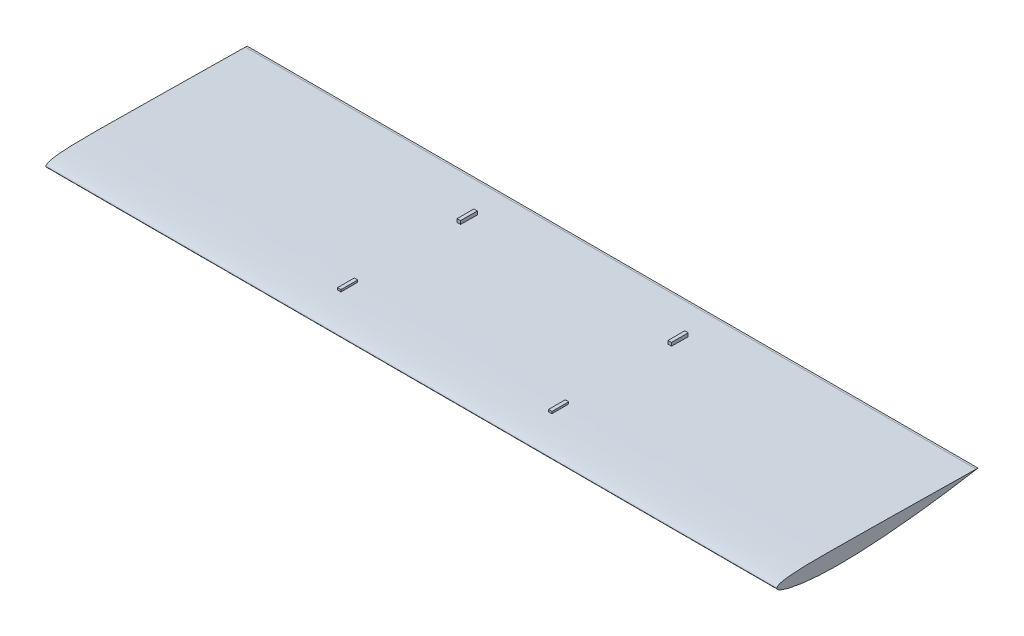
ISO-10303-21;
HEADER;
FILE_DESCRIPTION(('STEP AP214'),'2;1');
FILE_NAME('part.step','',(''),(''),'','','');
FILE_SCHEMA(('AUTOMOTIVE_DESIGN { 1 0 10303 214 1 1 1 1 }'));
ENDSEC;
DATA;
#1=APPLICATION_CONTEXT('core data for automotive mechanical design processes');
#2=APPLICATION_PROTOCOL_DEFINITION('international standard','automotive_design',2000,#1);
#3=PRODUCT_CONTEXT('',#1,'mechanical');
#4=PRODUCT('Part','Part','',(#3));
#5=PRODUCT_RELATED_PRODUCT_CATEGORY('part','',(#4));
#6=PRODUCT_DEFINITION_FORMATION('','',#4);
#7=PRODUCT_DEFINITION_CONTEXT('part definition',#1,'design');
#8=PRODUCT_DEFINITION('design','',#6,#7);
#9=PRODUCT_DEFINITION_SHAPE('','',#8);
#10=(LENGTH_UNIT() NAMED_UNIT(*) SI_UNIT(.MILLI.,.METRE.));
#11=(NAMED_UNIT(*) PLANE_ANGLE_UNIT() SI_UNIT($,.RADIAN.));
#12=(NAMED_UNIT(*) SI_UNIT($,.STERADIAN.) SOLID_ANGLE_UNIT());
#13=UNCERTAINTY_MEASURE_WITH_UNIT(LENGTH_MEASURE(1.E-05),#10,'distance_accuracy_value','');
#14=(GEOMETRIC_REPRESENTATION_CONTEXT(3) GLOBAL_UNCERTAINTY_ASSIGNED_CONTEXT((#13)) GLOBAL_UNIT_ASSIGNED_CONTEXT((#10,
#11,#12)) REPRESENTATION_CONTEXT('',''));
#15=CARTESIAN_POINT('',(0.,0.,0.));
#16=DIRECTION('',(0.,0.,1.));
#17=DIRECTION('',(1.,0.,0.));
#18=AXIS2_PLACEMENT_3D('',#15,#16,#17);
#19=CARTESIAN_POINT('',(-204.914499999998,2.03933345455898,1563.28431314968));
#20=DIRECTION('',(0.,0.,1.));
#21=DIRECTION('',(1.,0.,0.));
#22=AXIS2_PLACEMENT_3D('',#19,#20,#21);
#23=PLANE('',#22);
#24=DIRECTION('',(0.,1.,0.));
#25=VECTOR('',#24,1.);
#26=CARTESIAN_POINT('',(-204.914499999998,2.03933345455898,1563.28431314968));
#27=LINE('',#26,#25);
#28=CARTESIAN_POINT('',(-204.914499999998,80.0036239499038,1563.28431314969));
#29=VERTEX_POINT('',#28);
#30=CARTESIAN_POINT('',(-204.914499999998,83.8159031499461,1563.28431314968));
#31=VERTEX_POINT('',#30);
#32=EDGE_CURVE('E10',#29,#31,#27,.T.);
#33=ORIENTED_EDGE('',*,*,#32,.F.);
#34=DIRECTION('',(1.,0.,0.));
#35=VECTOR('',#34,1.);
#36=CARTESIAN_POINT('',(-685.512800211716,80.0036239499038,1563.28431314969));
#37=LINE('',#36,#35);
#38=CARTESIAN_POINT('',(-198.310499999997,80.0036239499039,1563.28431314968));
#39=VERTEX_POINT('',#38);
#40=EDGE_CURVE('E920',#29,#39,#37,.T.);
#41=ORIENTED_EDGE('',*,*,#40,.T.);
#42=DIRECTION('',(0.,1.,0.));
#43=VECTOR('',#42,1.);
#44=CARTESIAN_POINT('',(-198.310499999997,2.03933345455898,1563.28431314968));
#45=LINE('',#44,#43);
#46=CARTESIAN_POINT('',(-198.310499999997,83.8159031499461,1563.28431314968));
#47=VERTEX_POINT('',#46);
#48=EDGE_CURVE('E151',#39,#47,#45,.T.);
#49=ORIENTED_EDGE('',*,*,#48,.T.);
#50=DIRECTION('',(1.,0.,0.));
#51=VECTOR('',#50,1.);
#52=CARTESIAN_POINT('',(-204.914499999998,83.8159031499461,1563.28431314968));
#53=LINE('',#52,#51);
#54=EDGE_CURVE('E148',#31,#47,#53,.T.);
#55=ORIENTED_EDGE('',*,*,#54,.F.);
#56=EDGE_LOOP('',(#33,#41,#49,#55));
#57=FACE_BOUND('',#56,.T.);
#58=ADVANCED_FACE('F16',(#57),#23,.T.);
#59=CARTESIAN_POINT('',(-204.914499999998,2.03933345455898,1531.26702536521));
#60=DIRECTION('',(-1.,0.,0.));
#61=DIRECTION('',(0.,0.,1.));
#62=AXIS2_PLACEMENT_3D('',#59,#60,#61);
#63=PLANE('',#62);
#64=DIRECTION('',(0.,1.,0.));
#65=VECTOR('',#64,1.);
#66=CARTESIAN_POINT('',(-204.914499999998,2.03933345455898,1531.26702536521));
#67=LINE('',#66,#65);
#68=CARTESIAN_POINT('',(-204.914499999998,80.1263560566605,1531.26702536521));
#69=VERTEX_POINT('',#68);
#70=CARTESIAN_POINT('',(-204.914499999998,83.8159031499461,1531.26702536521));
#71=VERTEX_POINT('',#70);
#72=EDGE_CURVE('E25',#69,#71,#67,.T.);
#73=ORIENTED_EDGE('',*,*,#72,.F.);
#74=CARTESIAN_POINT('',(-204.914499999998,80.1263560566605,1531.26702536521));
#75=CARTESIAN_POINT('',(-204.914499999998,80.1263581057844,1531.26748250126));
#76=CARTESIAN_POINT('',(-204.914499999998,80.1545801844721,1537.5638467526));
#77=CARTESIAN_POINT('',(-204.914499999998,80.1666139038587,1548.23593381679));
#78=CARTESIAN_POINT('',(-204.914499999998,80.0714481750432,1558.90904107668));
#79=CARTESIAN_POINT('',(-204.914499999998,80.0036239499038,1563.28431314969));
#80=(BOUNDED_CURVE() B_SPLINE_CURVE(3,(#74,#75,#76,#77,#78,#79),.UNSPECIFIED.,.F.,
.F.) B_SPLINE_CURVE_WITH_KNOTS((4,1,1,4),(0.370653829376629,0.370655611138527,0.395194930786492,
0.412250239389891),
.UNSPECIFIED.) CURVE() GEOMETRIC_REPRESENTATION_ITEM() RATIONAL_B_SPLINE_CURVE((1.,1.,1.,1.,1.,1.)) REPRESENTATION_ITEM(''));
#81=EDGE_CURVE('E139',#69,#29,#80,.T.);
#82=ORIENTED_EDGE('',*,*,#81,.T.);
#83=ORIENTED_EDGE('',*,*,#32,.T.);
#84=DIRECTION('',(0.,0.,1.));
#85=VECTOR('',#84,1.);
#86=CARTESIAN_POINT('',(-204.914499999998,83.8159031499461,1531.26702536521));
#87=LINE('',#86,#85);
#88=EDGE_CURVE('E135',#71,#31,#87,.T.);
#89=ORIENTED_EDGE('',*,*,#88,.F.);
#90=EDGE_LOOP('',(#73,#82,#83,#89));
#91=FACE_BOUND('',#90,.T.);
#92=ADVANCED_FACE('F134',(#91),#63,.T.);
#93=CARTESIAN_POINT('',(-204.914499999998,2.03933345455898,1531.26702536521));
#94=DIRECTION('',(0.,0.,-1.));
#95=DIRECTION('',(0.,-1.,0.));
#96=AXIS2_PLACEMENT_3D('',#93,#94,#95);
#97=PLANE('',#96);
#98=DIRECTION('',(0.,1.,0.));
#99=VECTOR('',#98,1.);
#100=CARTESIAN_POINT('',(-198.310499999997,2.03933345455898,1531.26702536521));
#101=LINE('',#100,#99);
#102=CARTESIAN_POINT('',(-198.310499999997,80.1263560565787,1531.26702536521));
#103=VERTEX_POINT('',#102);
#104=CARTESIAN_POINT('',(-198.310499999997,83.8159031499461,1531.26702536521));
#105=VERTEX_POINT('',#104);
#106=EDGE_CURVE('E52',#103,#105,#101,.T.);
#107=ORIENTED_EDGE('',*,*,#106,.F.);
#108=DIRECTION('',(-1.,0.,0.));
#109=VECTOR('',#108,1.);
#110=CARTESIAN_POINT('',(-685.512800211716,80.1263560566605,1531.26702536521));
#111=LINE('',#110,#109);
#112=EDGE_CURVE('E911',#103,#69,#111,.T.);
#113=ORIENTED_EDGE('',*,*,#112,.T.);
#114=ORIENTED_EDGE('',*,*,#72,.T.);
#115=DIRECTION('',(-1.,0.,0.));
#116=VECTOR('',#115,1.);
#117=CARTESIAN_POINT('',(-204.914499999998,83.8159031499461,1531.26702536521));
#118=LINE('',#117,#116);
#119=EDGE_CURVE('E149',#105,#71,#118,.T.);
#120=ORIENTED_EDGE('',*,*,#119,.F.);
#121=EDGE_LOOP('',(#107,#113,#114,#120));
#122=FACE_BOUND('',#121,.T.);
#123=ADVANCED_FACE('F294',(#122),#97,.T.);
#124=CARTESIAN_POINT('',(-198.310499999997,2.03933345455898,1531.26702536521));
#125=DIRECTION('',(1.,0.,0.));
#126=DIRECTION('',(0.,1.,0.));
#127=AXIS2_PLACEMENT_3D('',#124,#125,#126);
#128=PLANE('',#127);
#129=ORIENTED_EDGE('',*,*,#48,.F.);
#130=CARTESIAN_POINT('',(-198.310499999997,80.0036239499039,1563.28431314968));
#131=CARTESIAN_POINT('',(-198.310499999997,80.0714481750433,1558.90904107668));
#132=CARTESIAN_POINT('',(-198.310499999997,80.1666139038587,1548.23593381679));
#133=CARTESIAN_POINT('',(-198.310499999997,80.1545801844721,1537.5638467526));
#134=CARTESIAN_POINT('',(-198.310499999997,80.1263581057844,1531.26748250126));
#135=CARTESIAN_POINT('',(-198.310499999997,80.1263560565787,1531.26702536521));
#136=(BOUNDED_CURVE() B_SPLINE_CURVE(3,(#130,#131,#132,#133,#134,#135),.UNSPECIFIED.,.F.,
.F.) B_SPLINE_CURVE_WITH_KNOTS((4,1,1,4),(0.587749760610117,0.604805069213507,0.629344388861473,
0.629346170623372),
.UNSPECIFIED.) CURVE() GEOMETRIC_REPRESENTATION_ITEM() RATIONAL_B_SPLINE_CURVE((1.,1.,1.,1.,1.,1.)) REPRESENTATION_ITEM(''));
#137=EDGE_CURVE('E914',#39,#103,#136,.T.);
#138=ORIENTED_EDGE('',*,*,#137,.T.);
#139=ORIENTED_EDGE('',*,*,#106,.T.);
#140=DIRECTION('',(0.,0.,-1.));
#141=VECTOR('',#140,1.);
#142=CARTESIAN_POINT('',(-198.310499999997,83.8159031499461,1531.26702536521));
#143=LINE('',#142,#141);
#144=EDGE_CURVE('E155',#47,#105,#143,.T.);
#145=ORIENTED_EDGE('',*,*,#144,.F.);
#146=EDGE_LOOP('',(#129,#138,#139,#145));
#147=FACE_BOUND('',#146,.T.);
#148=ADVANCED_FACE('F291',(#147),#128,.T.);
#149=CARTESIAN_POINT('',(0.,83.8159031499461,0.));
#150=DIRECTION('',(0.,-1.,0.));
#151=DIRECTION('',(0.,0.,-1.));
#152=AXIS2_PLACEMENT_3D('',#149,#150,#151);
#153=PLANE('',#152);
#154=ORIENTED_EDGE('',*,*,#54,.T.);
#155=ORIENTED_EDGE('',*,*,#144,.T.);
#156=ORIENTED_EDGE('',*,*,#119,.T.);
#157=ORIENTED_EDGE('',*,*,#88,.T.);
#158=EDGE_LOOP('',(#154,#155,#156,#157));
#159=FACE_BOUND('',#158,.T.);
#160=ADVANCED_FACE('F146',(#159),#153,.F.);
#161=CARTESIAN_POINT('',(198.310500000002,2.03933345455898,1563.28431314968));
#162=DIRECTION('',(0.,0.,1.));
#163=DIRECTION('',(1.,0.,0.));
#164=AXIS2_PLACEMENT_3D('',#161,#162,#163);
#165=PLANE('',#164);
#166=DIRECTION('',(0.,1.,0.));
#167=VECTOR('',#166,1.);
#168=CARTESIAN_POINT('',(198.310500000002,2.03933345455898,1563.28431314968));
#169=LINE('',#168,#167);
#170=CARTESIAN_POINT('',(198.310500000002,80.0036239499038,1563.28431314969));
#171=VERTEX_POINT('',#170);
#172=CARTESIAN_POINT('',(198.310500000002,83.8159031499461,1563.28431314968));
#173=VERTEX_POINT('',#172);
#174=EDGE_CURVE('E156',#171,#173,#169,.T.);
#175=ORIENTED_EDGE('',*,*,#174,.F.);
#176=DIRECTION('',(1.,0.,0.));
#177=VECTOR('',#176,1.);
#178=CARTESIAN_POINT('',(-685.512800211716,80.0036239499038,1563.28431314969));
#179=LINE('',#178,#177);
#180=CARTESIAN_POINT('',(204.914500000003,80.0036239499039,1563.28431314968));
#181=VERTEX_POINT('',#180);
#182=EDGE_CURVE('E842',#171,#181,#179,.T.);
#183=ORIENTED_EDGE('',*,*,#182,.T.);
#184=DIRECTION('',(0.,1.,0.));
#185=VECTOR('',#184,1.);
#186=CARTESIAN_POINT('',(204.914500000003,2.03933345455898,1563.28431314968));
#187=LINE('',#186,#185);
#188=CARTESIAN_POINT('',(204.914500000003,83.8159031499461,1563.28431314968));
#189=VERTEX_POINT('',#188);
#190=EDGE_CURVE('E222',#181,#189,#187,.T.);
#191=ORIENTED_EDGE('',*,*,#190,.T.);
#192=DIRECTION('',(1.,0.,0.));
#193=VECTOR('',#192,1.);
#194=CARTESIAN_POINT('',(198.310500000002,83.8159031499461,1563.28431314968));
#195=LINE('',#194,#193);
#196=EDGE_CURVE('E209',#173,#189,#195,.T.);
#197=ORIENTED_EDGE('',*,*,#196,.F.);
#198=EDGE_LOOP('',(#175,#183,#191,#197));
#199=FACE_BOUND('',#198,.T.);
#200=ADVANCED_FACE('F315',(#199),#165,.T.);
#201=CARTESIAN_POINT('',(198.310500000002,2.03933345455898,1531.26702536521));
#202=DIRECTION('',(-1.,0.,0.));
#203=DIRECTION('',(0.,0.,1.));
#204=AXIS2_PLACEMENT_3D('',#201,#202,#203);
#205=PLANE('',#204);
#206=DIRECTION('',(0.,1.,0.));
#207=VECTOR('',#206,1.);
#208=CARTESIAN_POINT('',(198.310500000002,2.03933345455898,1531.26702536521));
#209=LINE('',#208,#207);
#210=CARTESIAN_POINT('',(198.310500000002,80.1263560566605,1531.26702536521));
#211=VERTEX_POINT('',#210);
#212=CARTESIAN_POINT('',(198.310500000002,83.8159031499461,1531.26702536521));
#213=VERTEX_POINT('',#212);
#214=EDGE_CURVE('E164',#211,#213,#209,.T.);
#215=ORIENTED_EDGE('',*,*,#214,.F.);
#216=CARTESIAN_POINT('',(198.310500000002,80.1263560566605,1531.26702536521));
#217=CARTESIAN_POINT('',(198.310500000002,80.1263581057844,1531.26748250126));
#218=CARTESIAN_POINT('',(198.310500000002,80.1545801844721,1537.5638467526));
#219=CARTESIAN_POINT('',(198.310500000002,80.1666139038587,1548.23593381679));
#220=CARTESIAN_POINT('',(198.310500000002,80.0714481750432,1558.90904107668));
#221=CARTESIAN_POINT('',(198.310500000002,80.0036239499038,1563.28431314969));
#222=(BOUNDED_CURVE() B_SPLINE_CURVE(3,(#216,#217,#218,#219,#220,#221),.UNSPECIFIED.,.F.,
.F.) B_SPLINE_CURVE_WITH_KNOTS((4,1,1,4),(0.370653829376629,0.370655611138527,0.395194930786492,
0.412250239389891),
.UNSPECIFIED.) CURVE() GEOMETRIC_REPRESENTATION_ITEM() RATIONAL_B_SPLINE_CURVE((1.,1.,1.,1.,1.,1.)) REPRESENTATION_ITEM(''));
#223=EDGE_CURVE('E834',#211,#171,#222,.T.);
#224=ORIENTED_EDGE('',*,*,#223,.T.);
#225=ORIENTED_EDGE('',*,*,#174,.T.);
#226=DIRECTION('',(0.,0.,1.));
#227=VECTOR('',#226,1.);
#228=CARTESIAN_POINT('',(198.310500000002,83.8159031499461,1531.26702536521));
#229=LINE('',#228,#227);
#230=EDGE_CURVE('E218',#213,#173,#229,.T.);
#231=ORIENTED_EDGE('',*,*,#230,.F.);
#232=EDGE_LOOP('',(#215,#224,#225,#231));
#233=FACE_BOUND('',#232,.T.);
#234=ADVANCED_FACE('F311',(#233),#205,.T.);
#235=CARTESIAN_POINT('',(198.310500000002,2.03933345455898,1531.26702536521));
#236=DIRECTION('',(0.,0.,-1.));
#237=DIRECTION('',(0.,-1.,0.));
#238=AXIS2_PLACEMENT_3D('',#235,#236,#237);
#239=PLANE('',#238);
#240=DIRECTION('',(0.,1.,0.));
#241=VECTOR('',#240,1.);
#242=CARTESIAN_POINT('',(204.914500000003,2.03933345455898,1531.26702536521));
#243=LINE('',#242,#241);
#244=CARTESIAN_POINT('',(204.914500000003,80.1263560565787,1531.26702536521));
#245=VERTEX_POINT('',#244);
#246=CARTESIAN_POINT('',(204.914500000003,83.8159031499461,1531.26702536521));
#247=VERTEX_POINT('',#246);
#248=EDGE_CURVE('E224',#245,#247,#243,.T.);
#249=ORIENTED_EDGE('',*,*,#248,.F.);
#250=DIRECTION('',(-1.,0.,0.));
#251=VECTOR('',#250,1.);
#252=CARTESIAN_POINT('',(-685.512800211716,80.1263560566605,1531.26702536521));
#253=LINE('',#252,#251);
#254=EDGE_CURVE('E919',#245,#211,#253,.T.);
#255=ORIENTED_EDGE('',*,*,#254,.T.);
#256=ORIENTED_EDGE('',*,*,#214,.T.);
#257=DIRECTION('',(-1.,0.,0.));
#258=VECTOR('',#257,1.);
#259=CARTESIAN_POINT('',(198.310500000002,83.8159031499461,1531.26702536521));
#260=LINE('',#259,#258);
#261=EDGE_CURVE('E214',#247,#213,#260,.T.);
#262=ORIENTED_EDGE('',*,*,#261,.F.);
#263=EDGE_LOOP('',(#249,#255,#256,#262));
#264=FACE_BOUND('',#263,.T.);
#265=ADVANCED_FACE('F307',(#264),#239,.T.);
#266=CARTESIAN_POINT('',(204.914500000003,2.03933345455898,1531.26702536521));
#267=DIRECTION('',(1.,0.,0.));
#268=DIRECTION('',(0.,1.,0.));
#269=AXIS2_PLACEMENT_3D('',#266,#267,#268);
#270=PLANE('',#269);
#271=ORIENTED_EDGE('',*,*,#190,.F.);
#272=CARTESIAN_POINT('',(204.914500000003,80.0036239499039,1563.28431314968));
#273=CARTESIAN_POINT('',(204.914500000003,80.0714481750433,1558.90904107668));
#274=CARTESIAN_POINT('',(204.914500000003,80.1666139038587,1548.23593381679));
#275=CARTESIAN_POINT('',(204.914500000003,80.1545801844721,1537.5638467526));
#276=CARTESIAN_POINT('',(204.914500000003,80.1263581057844,1531.26748250126));
#277=CARTESIAN_POINT('',(204.914500000003,80.1263560565787,1531.26702536521));
#278=(BOUNDED_CURVE() B_SPLINE_CURVE(3,(#272,#273,#274,#275,#276,#277),.UNSPECIFIED.,.F.,
.F.) B_SPLINE_CURVE_WITH_KNOTS((4,1,1,4),(0.587749760610117,0.604805069213507,0.629344388861473,
0.629346170623372),
.UNSPECIFIED.) CURVE() GEOMETRIC_REPRESENTATION_ITEM() RATIONAL_B_SPLINE_CURVE((1.,1.,1.,1.,1.,1.)) REPRESENTATION_ITEM(''));
#279=EDGE_CURVE('E905',#181,#245,#278,.T.);
#280=ORIENTED_EDGE('',*,*,#279,.T.);
#281=ORIENTED_EDGE('',*,*,#248,.T.);
#282=DIRECTION('',(0.,0.,-1.));
#283=VECTOR('',#282,1.);
#284=CARTESIAN_POINT('',(204.914500000003,83.8159031499461,1531.26702536521));
#285=LINE('',#284,#283);
#286=EDGE_CURVE('E210',#189,#247,#285,.T.);
#287=ORIENTED_EDGE('',*,*,#286,.F.);
#288=EDGE_LOOP('',(#271,#280,#281,#287));
#289=FACE_BOUND('',#288,.T.);
#290=ADVANCED_FACE('F300',(#289),#270,.T.);
#291=CARTESIAN_POINT('',(0.,83.8159031499461,0.));
#292=DIRECTION('',(0.,-1.,0.));
#293=DIRECTION('',(0.,0.,-1.));
#294=AXIS2_PLACEMENT_3D('',#291,#292,#293);
#295=PLANE('',#294);
#296=ORIENTED_EDGE('',*,*,#196,.T.);
#297=ORIENTED_EDGE('',*,*,#286,.T.);
#298=ORIENTED_EDGE('',*,*,#261,.T.);
#299=ORIENTED_EDGE('',*,*,#230,.T.);
#300=EDGE_LOOP('',(#296,#297,#298,#299));
#301=FACE_BOUND('',#300,.T.);
#302=ADVANCED_FACE('F279',(#301),#295,.F.);
#303=CARTESIAN_POINT('',(198.3105,2.03933345455898,1334.80207008969));
#304=DIRECTION('',(0.,0.,1.));
#305=DIRECTION('',(1.,0.,0.));
#306=AXIS2_PLACEMENT_3D('',#303,#304,#305);
#307=PLANE('',#306);
#308=DIRECTION('',(0.,1.,0.));
#309=VECTOR('',#308,1.);
#310=CARTESIAN_POINT('',(198.3105,2.03933345455898,1334.80207008969));
#311=LINE('',#310,#309);
#312=CARTESIAN_POINT('',(198.3105,77.5418198172468,1334.80207008969));
#313=VERTEX_POINT('',#312);
#314=CARTESIAN_POINT('',(198.3105,83.8159031499461,1334.80207008969));
#315=VERTEX_POINT('',#314);
#316=EDGE_CURVE('E206',#313,#315,#311,.T.);
#317=ORIENTED_EDGE('',*,*,#316,.F.);
#318=DIRECTION('',(1.,0.,0.));
#319=VECTOR('',#318,1.);
#320=CARTESIAN_POINT('',(-685.512800211716,77.5418198172468,1334.80207008969));
#321=LINE('',#320,#319);
#322=CARTESIAN_POINT('',(204.9145,77.5418198169842,1334.80207007114));
#323=VERTEX_POINT('',#322);
#324=EDGE_CURVE('E827',#313,#323,#321,.T.);
#325=ORIENTED_EDGE('',*,*,#324,.T.);
#326=DIRECTION('',(0.,1.,0.));
#327=VECTOR('',#326,1.);
#328=CARTESIAN_POINT('',(204.9145,2.03933345455898,1334.80207008969));
#329=LINE('',#328,#327);
#330=CARTESIAN_POINT('',(204.9145,83.8159031499461,1334.80207008969));
#331=VERTEX_POINT('',#330);
#332=EDGE_CURVE('E180',#323,#331,#329,.T.);
#333=ORIENTED_EDGE('',*,*,#332,.T.);
#334=DIRECTION('',(1.,0.,0.));
#335=VECTOR('',#334,1.);
#336=CARTESIAN_POINT('',(198.3105,83.8159031499461,1334.80207008969));
#337=LINE('',#336,#335);
#338=EDGE_CURVE('E189',#315,#331,#337,.T.);
#339=ORIENTED_EDGE('',*,*,#338,.F.);
#340=EDGE_LOOP('',(#317,#325,#333,#339));
#341=FACE_BOUND('',#340,.T.);
#342=ADVANCED_FACE('F275',(#341),#307,.T.);
#343=CARTESIAN_POINT('',(198.3105,2.03933345455898,1302.78478230522));
#344=DIRECTION('',(-1.,0.,0.));
#345=DIRECTION('',(0.,0.,1.));
#346=AXIS2_PLACEMENT_3D('',#343,#344,#345);
#347=PLANE('',#346);
#348=DIRECTION('',(0.,1.,0.));
#349=VECTOR('',#348,1.);
#350=CARTESIAN_POINT('',(198.3105,2.03933345455898,1302.78478230522));
#351=LINE('',#350,#349);
#352=CARTESIAN_POINT('',(198.3105,77.1238573792197,1302.78478230522));
#353=VERTEX_POINT('',#352);
#354=CARTESIAN_POINT('',(198.3105,83.8159031499461,1302.78478230522));
#355=VERTEX_POINT('',#354);
#356=EDGE_CURVE('E203',#353,#355,#351,.T.);
#357=ORIENTED_EDGE('',*,*,#356,.F.);
#358=CARTESIAN_POINT('',(198.3105,77.1238573792197,1302.78478230522));
#359=CARTESIAN_POINT('',(198.3105,77.2030855955965,1309.3612453158));
#360=CARTESIAN_POINT('',(198.3105,77.3369944151827,1320.03374714883));
#361=CARTESIAN_POINT('',(198.3105,77.4838411847448,1330.70607842617));
#362=CARTESIAN_POINT('',(198.3105,77.5418198172468,1334.80207008969));
#363=(BOUNDED_CURVE() B_SPLINE_CURVE(3,(#358,#359,#360,#361,#362),.UNSPECIFIED.,.F.,
.F.) B_SPLINE_CURVE_WITH_KNOTS((4,1,4),(0.0737851250229269,0.0994192024326186,
0.115385211910126),
.UNSPECIFIED.) CURVE() GEOMETRIC_REPRESENTATION_ITEM() RATIONAL_B_SPLINE_CURVE((1.,1.,1.,1.,1.)) REPRESENTATION_ITEM(''));
#364=EDGE_CURVE('E816',#353,#313,#363,.T.);
#365=ORIENTED_EDGE('',*,*,#364,.T.);
#366=ORIENTED_EDGE('',*,*,#316,.T.);
#367=DIRECTION('',(0.,0.,1.));
#368=VECTOR('',#367,1.);
#369=CARTESIAN_POINT('',(198.3105,83.8159031499461,1302.78478230522));
#370=LINE('',#369,#368);
#371=EDGE_CURVE('E176',#355,#315,#370,.T.);
#372=ORIENTED_EDGE('',*,*,#371,.F.);
#373=EDGE_LOOP('',(#357,#365,#366,#372));
#374=FACE_BOUND('',#373,.T.);
#375=ADVANCED_FACE('F278',(#374),#347,.T.);
#376=CARTESIAN_POINT('',(198.3105,2.03933345455898,1302.78478230522));
#377=DIRECTION('',(0.,0.,-1.));
#378=DIRECTION('',(0.,-1.,0.));
#379=AXIS2_PLACEMENT_3D('',#376,#377,#378);
#380=PLANE('',#379);
#381=DIRECTION('',(0.,1.,0.));
#382=VECTOR('',#381,1.);
#383=CARTESIAN_POINT('',(204.9145,2.03933345455898,1302.78478230522));
#384=LINE('',#383,#382);
#385=CARTESIAN_POINT('',(204.9145,77.1238573789917,1302.78478230522));
#386=VERTEX_POINT('',#385);
#387=CARTESIAN_POINT('',(204.9145,83.8159031499461,1302.78478230522));
#388=VERTEX_POINT('',#387);
#389=EDGE_CURVE('E202',#386,#388,#384,.T.);
#390=ORIENTED_EDGE('',*,*,#389,.F.);
#391=DIRECTION('',(-1.,0.,0.));
#392=VECTOR('',#391,1.);
#393=CARTESIAN_POINT('',(-685.512800211716,77.1238573792197,1302.78478230522));
#394=LINE('',#393,#392);
#395=EDGE_CURVE('E825',#386,#353,#394,.T.);
#396=ORIENTED_EDGE('',*,*,#395,.T.);
#397=ORIENTED_EDGE('',*,*,#356,.T.);
#398=DIRECTION('',(-1.,0.,0.));
#399=VECTOR('',#398,1.);
#400=CARTESIAN_POINT('',(198.3105,83.8159031499461,1302.78478230522));
#401=LINE('',#400,#399);
#402=EDGE_CURVE('E181',#388,#355,#401,.T.);
#403=ORIENTED_EDGE('',*,*,#402,.F.);
#404=EDGE_LOOP('',(#390,#396,#397,#403));
#405=FACE_BOUND('',#404,.T.);
#406=ADVANCED_FACE('F286',(#405),#380,.T.);
#407=CARTESIAN_POINT('',(204.9145,2.03933345455898,1302.78478230522));
#408=DIRECTION('',(1.,0.,0.));
#409=DIRECTION('',(0.,1.,0.));
#410=AXIS2_PLACEMENT_3D('',#407,#408,#409);
#411=PLANE('',#410);
#412=ORIENTED_EDGE('',*,*,#332,.F.);
#413=CARTESIAN_POINT('',(204.9145,77.5418198169842,1334.80207007114));
#414=CARTESIAN_POINT('',(204.9145,77.4838411845746,1330.7060784138));
#415=CARTESIAN_POINT('',(204.9145,77.3369944151051,1320.03374714265));
#416=CARTESIAN_POINT('',(204.9145,77.2030855955965,1309.3612453158));
#417=CARTESIAN_POINT('',(204.9145,77.1238573789917,1302.78478230522));
#418=(BOUNDED_CURVE() B_SPLINE_CURVE(3,(#413,#414,#415,#416,#417),.UNSPECIFIED.,.F.,
.F.) B_SPLINE_CURVE_WITH_KNOTS((4,1,4),(0.884614788113973,0.900580797567381,0.926214874977076),
.UNSPECIFIED.) CURVE() GEOMETRIC_REPRESENTATION_ITEM() RATIONAL_B_SPLINE_CURVE((1.,1.,1.,1.,1.)) REPRESENTATION_ITEM(''));
#419=EDGE_CURVE('E833',#323,#386,#418,.T.);
#420=ORIENTED_EDGE('',*,*,#419,.T.);
#421=ORIENTED_EDGE('',*,*,#389,.T.);
#422=DIRECTION('',(0.,0.,-1.));
#423=VECTOR('',#422,1.);
#424=CARTESIAN_POINT('',(204.9145,83.8159031499461,1302.78478230522));
#425=LINE('',#424,#423);
#426=EDGE_CURVE('E185',#331,#388,#425,.T.);
#427=ORIENTED_EDGE('',*,*,#426,.F.);
#428=EDGE_LOOP('',(#412,#420,#421,#427));
#429=FACE_BOUND('',#428,.T.);
#430=ADVANCED_FACE('F263',(#429),#411,.T.);
#431=CARTESIAN_POINT('',(0.,83.8159031499461,0.));
#432=DIRECTION('',(0.,-1.,0.));
#433=DIRECTION('',(0.,0.,-1.));
#434=AXIS2_PLACEMENT_3D('',#431,#432,#433);
#435=PLANE('',#434);
#436=ORIENTED_EDGE('',*,*,#338,.T.);
#437=ORIENTED_EDGE('',*,*,#426,.T.);
#438=ORIENTED_EDGE('',*,*,#402,.T.);
#439=ORIENTED_EDGE('',*,*,#371,.T.);
#440=EDGE_LOOP('',(#436,#437,#438,#439));
#441=FACE_BOUND('',#440,.T.);
#442=ADVANCED_FACE('F260',(#441),#435,.F.);
#443=CARTESIAN_POINT('',(-198.3105,2.03933345455898,1302.78478230522));
#444=DIRECTION('',(1.,0.,0.));
#445=DIRECTION('',(0.,1.,0.));
#446=AXIS2_PLACEMENT_3D('',#443,#444,#445);
#447=PLANE('',#446);
#448=DIRECTION('',(0.,1.,0.));
#449=VECTOR('',#448,1.);
#450=CARTESIAN_POINT('',(-198.3105,2.03933345455898,1334.80207008969));
#451=LINE('',#450,#449);
#452=CARTESIAN_POINT('',(-198.3105,77.5418198169842,1334.80207007114));
#453=VERTEX_POINT('',#452);
#454=CARTESIAN_POINT('',(-198.3105,83.8159031499461,1334.80207008969));
#455=VERTEX_POINT('',#454);
#456=EDGE_CURVE('E194',#453,#455,#451,.T.);
#457=ORIENTED_EDGE('',*,*,#456,.F.);
#458=CARTESIAN_POINT('',(-198.3105,77.5418198169842,1334.80207007114));
#459=CARTESIAN_POINT('',(-198.3105,77.4838411845746,1330.7060784138));
#460=CARTESIAN_POINT('',(-198.3105,77.3369944151051,1320.03374714265));
#461=CARTESIAN_POINT('',(-198.3105,77.2030855955965,1309.3612453158));
#462=CARTESIAN_POINT('',(-198.3105,77.1238573792197,1302.78478230522));
#463=(BOUNDED_CURVE() B_SPLINE_CURVE(3,(#458,#459,#460,#461,#462),.UNSPECIFIED.,.F.,
.F.) B_SPLINE_CURVE_WITH_KNOTS((4,1,4),(0.884614788113973,0.900580797567381,0.926214874977073),
.UNSPECIFIED.) CURVE() GEOMETRIC_REPRESENTATION_ITEM() RATIONAL_B_SPLINE_CURVE((1.,1.,1.,1.,1.)) REPRESENTATION_ITEM(''));
#464=CARTESIAN_POINT('',(-198.3105,77.1238573792197,1302.78478230522));
#465=VERTEX_POINT('',#464);
#466=EDGE_CURVE('E875',#453,#465,#463,.T.);
#467=ORIENTED_EDGE('',*,*,#466,.T.);
#468=DIRECTION('',(0.,1.,0.));
#469=VECTOR('',#468,1.);
#470=CARTESIAN_POINT('',(-198.3105,2.03933345455898,1302.78478230522));
#471=LINE('',#470,#469);
#472=CARTESIAN_POINT('',(-198.3105,83.8159031499461,1302.78478230522));
#473=VERTEX_POINT('',#472);
#474=EDGE_CURVE('E174',#465,#473,#471,.T.);
#475=ORIENTED_EDGE('',*,*,#474,.T.);
#476=DIRECTION('',(0.,0.,-1.));
#477=VECTOR('',#476,1.);
#478=CARTESIAN_POINT('',(-198.3105,83.8159031499461,1302.78478230522));
#479=LINE('',#478,#477);
#480=EDGE_CURVE('E888',#455,#473,#479,.T.);
#481=ORIENTED_EDGE('',*,*,#480,.F.);
#482=EDGE_LOOP('',(#457,#467,#475,#481));
#483=FACE_BOUND('',#482,.T.);
#484=ADVANCED_FACE('F258',(#483),#447,.T.);
#485=CARTESIAN_POINT('',(-204.9145,2.03933345455898,1334.80207008969));
#486=DIRECTION('',(0.,0.,1.));
#487=DIRECTION('',(1.,0.,0.));
#488=AXIS2_PLACEMENT_3D('',#485,#486,#487);
#489=PLANE('',#488);
#490=DIRECTION('',(0.,1.,0.));
#491=VECTOR('',#490,1.);
#492=CARTESIAN_POINT('',(-204.9145,2.03933345455898,1334.80207008969));
#493=LINE('',#492,#491);
#494=CARTESIAN_POINT('',(-204.9145,77.5418198169842,1334.80207007114));
#495=VERTEX_POINT('',#494);
#496=CARTESIAN_POINT('',(-204.9145,83.8159031499461,1334.80207008969));
#497=VERTEX_POINT('',#496);
#498=EDGE_CURVE('E190',#495,#497,#493,.T.);
#499=ORIENTED_EDGE('',*,*,#498,.F.);
#500=DIRECTION('',(1.,0.,0.));
#501=VECTOR('',#500,1.);
#502=CARTESIAN_POINT('',(-685.512800211716,77.5418198172468,1334.80207008969));
#503=LINE('',#502,#501);
#504=EDGE_CURVE('E881',#495,#453,#503,.T.);
#505=ORIENTED_EDGE('',*,*,#504,.T.);
#506=ORIENTED_EDGE('',*,*,#456,.T.);
#507=DIRECTION('',(1.,0.,0.));
#508=VECTOR('',#507,1.);
#509=CARTESIAN_POINT('',(-204.9145,83.8159031499461,1334.80207008969));
#510=LINE('',#509,#508);
#511=EDGE_CURVE('E170',#497,#455,#510,.T.);
#512=ORIENTED_EDGE('',*,*,#511,.F.);
#513=EDGE_LOOP('',(#499,#505,#506,#512));
#514=FACE_BOUND('',#513,.T.);
#515=ADVANCED_FACE('F273',(#514),#489,.T.);
#516=CARTESIAN_POINT('',(-204.9145,2.03933345455898,1302.78478230522));
#517=DIRECTION('',(-1.,0.,0.));
#518=DIRECTION('',(0.,0.,1.));
#519=AXIS2_PLACEMENT_3D('',#516,#517,#518);
#520=PLANE('',#519);
#521=DIRECTION('',(0.,1.,0.));
#522=VECTOR('',#521,1.);
#523=CARTESIAN_POINT('',(-204.9145,2.03933345455898,1302.78478230522));
#524=LINE('',#523,#522);
#525=CARTESIAN_POINT('',(-204.9145,77.1238573792197,1302.78478230522));
#526=VERTEX_POINT('',#525);
#527=CARTESIAN_POINT('',(-204.9145,83.8159031499461,1302.78478230522));
#528=VERTEX_POINT('',#527);
#529=EDGE_CURVE('E184',#526,#528,#524,.T.);
#530=ORIENTED_EDGE('',*,*,#529,.F.);
#531=CARTESIAN_POINT('',(-204.9145,77.1238573792197,1302.78478230522));
#532=CARTESIAN_POINT('',(-204.9145,77.2030855955965,1309.3612453158));
#533=CARTESIAN_POINT('',(-204.9145,77.3369944151051,1320.03374714265));
#534=CARTESIAN_POINT('',(-204.9145,77.4838411845746,1330.7060784138));
#535=CARTESIAN_POINT('',(-204.9145,77.5418198169842,1334.80207007114));
#536=(BOUNDED_CURVE() B_SPLINE_CURVE(3,(#531,#532,#533,#534,#535),.UNSPECIFIED.,.F.,
.F.) B_SPLINE_CURVE_WITH_KNOTS((4,1,4),(0.0737851250229269,0.0994192024326186,
0.115385211886027),
.UNSPECIFIED.) CURVE() GEOMETRIC_REPRESENTATION_ITEM() RATIONAL_B_SPLINE_CURVE((1.,1.,1.,1.,1.)) REPRESENTATION_ITEM(''));
#537=EDGE_CURVE('E829',#526,#495,#536,.T.);
#538=ORIENTED_EDGE('',*,*,#537,.T.);
#539=ORIENTED_EDGE('',*,*,#498,.T.);
#540=DIRECTION('',(0.,0.,1.));
#541=VECTOR('',#540,1.);
#542=CARTESIAN_POINT('',(-204.9145,83.8159031499461,1302.78478230522));
#543=LINE('',#542,#541);
#544=EDGE_CURVE('E175',#528,#497,#543,.T.);
#545=ORIENTED_EDGE('',*,*,#544,.F.);
#546=EDGE_LOOP('',(#530,#538,#539,#545));
#547=FACE_BOUND('',#546,.T.);
#548=ADVANCED_FACE('F270',(#547),#520,.T.);
#549=CARTESIAN_POINT('',(-204.9145,2.03933345455898,1302.78478230522));
#550=DIRECTION('',(0.,0.,-1.));
#551=DIRECTION('',(0.,-1.,0.));
#552=AXIS2_PLACEMENT_3D('',#549,#550,#551);
#553=PLANE('',#552);
#554=ORIENTED_EDGE('',*,*,#474,.F.);
#555=DIRECTION('',(-1.,0.,0.));
#556=VECTOR('',#555,1.);
#557=CARTESIAN_POINT('',(-685.512800211716,77.1238573792197,1302.78478230522));
#558=LINE('',#557,#556);
#559=EDGE_CURVE('E864',#465,#526,#558,.T.);
#560=ORIENTED_EDGE('',*,*,#559,.T.);
#561=ORIENTED_EDGE('',*,*,#529,.T.);
#562=DIRECTION('',(-1.,0.,0.));
#563=VECTOR('',#562,1.);
#564=CARTESIAN_POINT('',(-204.9145,83.8159031499461,1302.78478230522));
#565=LINE('',#564,#563);
#566=EDGE_CURVE('E168',#473,#528,#565,.T.);
#567=ORIENTED_EDGE('',*,*,#566,.F.);
#568=EDGE_LOOP('',(#554,#560,#561,#567));
#569=FACE_BOUND('',#568,.T.);
#570=ADVANCED_FACE('F268',(#569),#553,.T.);
#571=CARTESIAN_POINT('',(0.,83.8159031499461,0.));
#572=DIRECTION('',(0.,1.,0.));
#573=DIRECTION('',(1.,0.,0.));
#574=AXIS2_PLACEMENT_3D('',#571,#572,#573);
#575=PLANE('',#574);
#576=ORIENTED_EDGE('',*,*,#480,.T.);
#577=ORIENTED_EDGE('',*,*,#566,.T.);
#578=ORIENTED_EDGE('',*,*,#544,.T.);
#579=ORIENTED_EDGE('',*,*,#511,.T.);
#580=EDGE_LOOP('',(#576,#577,#578,#579));
#581=FACE_BOUND('',#580,.T.);
#582=ADVANCED_FACE('F265',(#581),#575,.T.);
#583=CARTESIAN_POINT('',(-698.5,68.5439987686895,1626.55579217223));
#584=DIRECTION('',(1.,0.,0.));
#585=DIRECTION('',(0.,1.,0.));
#586=AXIS2_PLACEMENT_3D('',#583,#584,#585);
#587=PLANE('',#586);
#588=DIRECTION('',(0.,0.171381480439997,-0.985204744285265));
#589=VECTOR('',#588,1.);
#590=CARTESIAN_POINT('',(-698.5,75.8593871493664,1245.98475501479));
#591=LINE('',#590,#589);
#592=CARTESIAN_POINT('',(-698.5,75.8593871493664,1245.98475501479));
#593=VERTEX_POINT('',#592);
#594=CARTESIAN_POINT('',(-698.5,76.4637958626109,1242.51024697432));
#595=VERTEX_POINT('',#594);
#596=EDGE_CURVE('E1101',#593,#595,#591,.T.);
#597=ORIENTED_EDGE('',*,*,#596,.F.);
#598=CARTESIAN_POINT('',(-698.499999999993,76.499366852603,1245.99503959024));
#599=CARTESIAN_POINT('',(-698.499999999993,76.5646297976943,1252.38867185063));
#600=CARTESIAN_POINT('',(-698.499999999993,76.6950012338333,1265.16080493114));
#601=CARTESIAN_POINT('',(-698.499999999993,76.9773001181167,1290.66724093826));
#602=CARTESIAN_POINT('',(-698.499999999993,77.3543030326871,1322.48847067392));
#603=CARTESIAN_POINT('',(-698.499999999993,77.9162680403241,1360.61870813494));
#604=CARTESIAN_POINT('',(-698.499999999993,78.5358461752536,1398.68216567312));
#605=CARTESIAN_POINT('',(-698.499999999993,79.186952977143,1436.69102855129));
#606=CARTESIAN_POINT('',(-698.499999999993,79.6376731894527,1474.59001081164));
#607=CARTESIAN_POINT('',(-698.499999999993,79.9503733259163,1506.11097405901));
#608=CARTESIAN_POINT('',(-698.499999999993,80.1474877753599,1531.27395373535));
#609=CARTESIAN_POINT('',(-698.499999999993,80.1687952888613,1550.17049202947));
#610=CARTESIAN_POINT('',(-698.499999999993,79.9653578846433,1569.11801733074));
#611=CARTESIAN_POINT('',(-698.499999999993,79.4442090750329,1584.93676699276));
#612=CARTESIAN_POINT('',(-698.499999999993,78.6179316835073,1597.66934269598));
#613=CARTESIAN_POINT('',(-698.499999999993,77.7011894539018,1607.23157060672));
#614=CARTESIAN_POINT('',(-698.499999999993,76.2751604416913,1615.51714652839));
#615=CARTESIAN_POINT('',(-698.499999999993,74.6988850107673,1622.07587437183));
#616=CARTESIAN_POINT('',(-698.499999999993,70.2817161285073,1629.46107040252));
#617=CARTESIAN_POINT('',(-698.499999999993,64.6243116258409,1622.92378847171));
#618=CARTESIAN_POINT('',(-698.499999999993,62.2952888024282,1616.53169800888));
#619=CARTESIAN_POINT('',(-698.499999999993,59.3682989381772,1608.56933025701));
#620=CARTESIAN_POINT('',(-698.499999999993,57.2349710207016,1599.04848422378));
#621=CARTESIAN_POINT('',(-698.499999999993,54.8105772036973,1586.33057963594));
#622=CARTESIAN_POINT('',(-698.499999999993,52.6221608653713,1570.37428683129));
#623=CARTESIAN_POINT('',(-698.499999999993,50.8886050445277,1551.15776822178));
#624=CARTESIAN_POINT('',(-698.499999999993,49.8534429772613,1531.91988698097));
#625=CARTESIAN_POINT('',(-698.499999999993,49.2720092003839,1506.25992949716));
#626=CARTESIAN_POINT('',(-698.499999999993,49.901062710311,1474.25073081649));
#627=CARTESIAN_POINT('',(-698.499999999993,52.1252103667811,1435.96162601531));
#628=CARTESIAN_POINT('',(-698.499999999993,55.2285170927596,1397.79692005989));
#629=CARTESIAN_POINT('',(-698.499999999993,59.2036514350586,1359.70204334597));
#630=CARTESIAN_POINT('',(-698.499999999993,63.948490811501,1321.68590660716));
#631=CARTESIAN_POINT('',(-698.499999999993,68.52600932581,1290.08074603011));
#632=CARTESIAN_POINT('',(-698.499999999993,72.5764008445253,1264.85735241942));
#633=CARTESIAN_POINT('',(-698.499999999993,74.7653708136938,1252.27382476412));
#634=CARTESIAN_POINT('',(-698.499999999993,75.8593871493664,1245.98475501479));
#635=(BOUNDED_CURVE() B_SPLINE_CURVE(3,(#598,#599,#600,#601,#602,#603,#604,#605,#606,#607,#608,
#609,#610,#611,#612,#613,#614,#615,#616,#617,#618,#619,#620,#621,#622,#623,#624,#625,#626,#627,
#628,#629,#630,#631,#632,#633,#634),.UNSPECIFIED.,.F.,.F.) B_SPLINE_CURVE_WITH_KNOTS((4,1,1,1,1,
1,1,1,1,1,1,1,1,1,1,1,1,1,1,1,1,1,1,1,1,1,1,1,1,1,1,1,1,1,4),(0.,0.024920923925921,
0.0497828689401779,0.0994192024326189,0.148954982369348,0.19841409173907,0.247793886360809,
0.297118649713162,0.346137821653749,0.370655611138527,0.395194930786493,0.419790533628959,
0.444494979281921,0.45690984569632,0.46943565788578,0.482176169238933,0.488808800115614,
0.497619319593217,0.506441571795821,0.513044984189842,0.52597146092651,0.538646761073753,
0.551257798956951,0.57636181679841,0.601409300505453,0.626433493812753,0.651439180859234,
0.701431936479584,0.751161391299153,0.800907818962228,0.850660107810834,0.900433078027226,
0.950218746438945,0.975120031168477,1.),
.UNSPECIFIED.) CURVE() GEOMETRIC_REPRESENTATION_ITEM() RATIONAL_B_SPLINE_CURVE((1.,1.,1.,1.,1.,
1.,1.,1.,1.,1.,1.,1.,1.,1.,1.,1.,1.,1.,1.,1.,1.,1.,1.,1.,1.,1.,1.,1.,1.,1.,1.,1.,1.,1.,1.,1.,1.)) REPRESENTATION_ITEM(''));
#636=CARTESIAN_POINT('',(-698.5,76.499366852603,1245.99503959024));
#637=VERTEX_POINT('',#636);
#638=EDGE_CURVE('E1045',#637,#593,#635,.T.);
#639=ORIENTED_EDGE('',*,*,#638,.F.);
#640=DIRECTION('',(0.,0.010206959476593,0.999947907632314));
#641=VECTOR('',#640,1.);
#642=CARTESIAN_POINT('',(-698.5,76.4637958626109,1242.51024697432));
#643=LINE('',#642,#641);
#644=EDGE_CURVE('E1061',#595,#637,#643,.T.);
#645=ORIENTED_EDGE('',*,*,#644,.F.);
#646=EDGE_LOOP('',(#597,#639,#645));
#647=FACE_BOUND('',#646,.T.);
#648=ADVANCED_FACE('F257',(#647),#587,.F.);
#649=CARTESIAN_POINT('',(698.5,68.5439987686895,1626.55579217223));
#650=DIRECTION('',(1.,0.,0.));
#651=DIRECTION('',(0.,1.,0.));
#652=AXIS2_PLACEMENT_3D('',#649,#650,#651);
#653=PLANE('',#652);
#654=DIRECTION('',(0.,0.171381480439997,-0.985204744285265));
#655=VECTOR('',#654,1.);
#656=CARTESIAN_POINT('',(698.5,75.8593871493664,1245.98475501479));
#657=LINE('',#656,#655);
#658=CARTESIAN_POINT('',(698.5,75.8593871493664,1245.98475501479));
#659=VERTEX_POINT('',#658);
#660=CARTESIAN_POINT('',(698.5,76.4637958626109,1242.51024697432));
#661=VERTEX_POINT('',#660);
#662=EDGE_CURVE('E1073',#659,#661,#657,.T.);
#663=ORIENTED_EDGE('',*,*,#662,.T.);
#664=DIRECTION('',(0.,0.010206959476593,0.999947907632314));
#665=VECTOR('',#664,1.);
#666=CARTESIAN_POINT('',(698.5,76.4637958626109,1242.51024697432));
#667=LINE('',#666,#665);
#668=CARTESIAN_POINT('',(698.5,76.499366852603,1245.99503959024));
#669=VERTEX_POINT('',#668);
#670=EDGE_CURVE('E1060',#661,#669,#667,.T.);
#671=ORIENTED_EDGE('',*,*,#670,.T.);
#672=CARTESIAN_POINT('',(698.5,75.8593871493664,1245.98475501479));
#673=CARTESIAN_POINT('',(698.5,74.7653708136938,1252.27382476412));
#674=CARTESIAN_POINT('',(698.5,72.5764008445253,1264.85735241942));
#675=CARTESIAN_POINT('',(698.5,68.52600932581,1290.08074603011));
#676=CARTESIAN_POINT('',(698.5,63.948490811501,1321.68590660716));
#677=CARTESIAN_POINT('',(698.5,59.2036514350586,1359.70204334597));
#678=CARTESIAN_POINT('',(698.5,55.2285170927596,1397.79692005989));
#679=CARTESIAN_POINT('',(698.5,52.1252103667811,1435.96162601531));
#680=CARTESIAN_POINT('',(698.5,49.901062710311,1474.25073081649));
#681=CARTESIAN_POINT('',(698.5,49.2720092003839,1506.25992949716));
#682=CARTESIAN_POINT('',(698.5,49.8534429772613,1531.91988698097));
#683=CARTESIAN_POINT('',(698.5,50.8886050445277,1551.15776822178));
#684=CARTESIAN_POINT('',(698.5,52.6221608653713,1570.37428683129));
#685=CARTESIAN_POINT('',(698.5,54.8105772036973,1586.33057963594));
#686=CARTESIAN_POINT('',(698.5,57.2349710207016,1599.04848422378));
#687=CARTESIAN_POINT('',(698.5,59.3682989381772,1608.56933025701));
#688=CARTESIAN_POINT('',(698.5,62.2952888024282,1616.53169800888));
#689=CARTESIAN_POINT('',(698.5,64.6243116258409,1622.92378847171));
#690=CARTESIAN_POINT('',(698.5,70.2817161285073,1629.46107040252));
#691=CARTESIAN_POINT('',(698.5,74.6988850107673,1622.07587437183));
#692=CARTESIAN_POINT('',(698.5,76.2751604416913,1615.51714652838));
#693=CARTESIAN_POINT('',(698.5,77.7011894539018,1607.23157060672));
#694=CARTESIAN_POINT('',(698.5,78.6179316835073,1597.66934269598));
#695=CARTESIAN_POINT('',(698.5,79.4442090750329,1584.93676699276));
#696=CARTESIAN_POINT('',(698.5,79.9653578846433,1569.11801733074));
#697=CARTESIAN_POINT('',(698.5,80.1687952888613,1550.17049202947));
#698=CARTESIAN_POINT('',(698.5,80.1474877753599,1531.27395373534));
#699=CARTESIAN_POINT('',(698.5,79.9503733259163,1506.11097405901));
#700=CARTESIAN_POINT('',(698.5,79.6376731894527,1474.59001081164));
#701=CARTESIAN_POINT('',(698.5,79.186952977143,1436.69102855129));
#702=CARTESIAN_POINT('',(698.5,78.5358461752536,1398.68216567312));
#703=CARTESIAN_POINT('',(698.5,77.9162680403241,1360.61870813494));
#704=CARTESIAN_POINT('',(698.5,77.3543030326871,1322.48847067392));
#705=CARTESIAN_POINT('',(698.5,76.9773001181167,1290.66724093826));
#706=CARTESIAN_POINT('',(698.5,76.6950012338333,1265.16080493114));
#707=CARTESIAN_POINT('',(698.5,76.5646297976943,1252.38867185063));
#708=CARTESIAN_POINT('',(698.5,76.499366852603,1245.99503959024));
#709=(BOUNDED_CURVE() B_SPLINE_CURVE(3,(#672,#673,#674,#675,#676,#677,#678,#679,#680,#681,#682,
#683,#684,#685,#686,#687,#688,#689,#690,#691,#692,#693,#694,#695,#696,#697,#698,#699,#700,#701,
#702,#703,#704,#705,#706,#707,#708),.UNSPECIFIED.,.F.,.F.) B_SPLINE_CURVE_WITH_KNOTS((4,1,1,1,1,
1,1,1,1,1,1,1,1,1,1,1,1,1,1,1,1,1,1,1,1,1,1,1,1,1,1,1,1,1,4),(0.,0.0248799688315228,
0.0497812535610554,0.0995669219727736,0.149339892189166,0.199092181037773,0.248838608700846,
0.298568063520415,0.348560819140766,0.373566506187247,0.398590699494547,0.42363818320159,
0.448742201043049,0.461353238926247,0.47402853907349,0.486955015810158,0.493558428204179,
0.502380680406783,0.511191199884386,0.517823830761067,0.53056434211422,0.54309015430368,
0.555505020718079,0.580209466371041,0.604805069213507,0.629344388861473,0.653862178346251,
0.702881350286838,0.752206113639191,0.80158590826093,0.851045017630652,0.900580797567381,
0.950217131059822,0.975079076074079,1.),
.UNSPECIFIED.) CURVE() GEOMETRIC_REPRESENTATION_ITEM() RATIONAL_B_SPLINE_CURVE((1.,1.,1.,1.,1.,
1.,1.,1.,1.,1.,1.,1.,1.,1.,1.,1.,1.,1.,1.,1.,1.,1.,1.,1.,1.,1.,1.,1.,1.,1.,1.,1.,1.,1.,1.,1.,1.)) REPRESENTATION_ITEM(''));
#710=EDGE_CURVE('E239',#669,#659,#709,.F.);
#711=ORIENTED_EDGE('',*,*,#710,.T.);
#712=EDGE_LOOP('',(#663,#671,#711));
#713=FACE_BOUND('',#712,.T.);
#714=ADVANCED_FACE('F246',(#713),#653,.T.);
#715=CARTESIAN_POINT('',(-698.5,75.8593871493664,1245.98475501479));
#716=CARTESIAN_POINT('',(698.5,75.8593871493664,1245.98475501479));
#717=CARTESIAN_POINT('',(-698.5,74.7653708136938,1252.27382476412));
#718=CARTESIAN_POINT('',(698.5,74.7653708136938,1252.27382476412));
#719=CARTESIAN_POINT('',(-698.5,72.5764008445253,1264.85735241942));
#720=CARTESIAN_POINT('',(698.5,72.5764008445253,1264.85735241942));
#721=CARTESIAN_POINT('',(-698.5,68.52600932581,1290.08074603011));
#722=CARTESIAN_POINT('',(698.5,68.52600932581,1290.08074603011));
#723=CARTESIAN_POINT('',(-698.5,63.948490811501,1321.68590660716));
#724=CARTESIAN_POINT('',(698.5,63.948490811501,1321.68590660716));
#725=CARTESIAN_POINT('',(-698.5,59.2036514350586,1359.70204334597));
#726=CARTESIAN_POINT('',(698.5,59.2036514350586,1359.70204334597));
#727=CARTESIAN_POINT('',(-698.5,55.2285170927596,1397.79692005989));
#728=CARTESIAN_POINT('',(698.5,55.2285170927596,1397.79692005989));
#729=CARTESIAN_POINT('',(-698.5,52.1252103667811,1435.96162601531));
#730=CARTESIAN_POINT('',(698.5,52.1252103667811,1435.96162601531));
#731=CARTESIAN_POINT('',(-698.5,49.901062710311,1474.25073081649));
#732=CARTESIAN_POINT('',(698.5,49.901062710311,1474.25073081649));
#733=CARTESIAN_POINT('',(-698.5,49.2720092003839,1506.25992949716));
#734=CARTESIAN_POINT('',(698.5,49.2720092003839,1506.25992949716));
#735=CARTESIAN_POINT('',(-698.5,49.8534429772613,1531.91988698097));
#736=CARTESIAN_POINT('',(698.5,49.8534429772613,1531.91988698097));
#737=CARTESIAN_POINT('',(-698.5,50.8886050445277,1551.15776822178));
#738=CARTESIAN_POINT('',(698.5,50.8886050445277,1551.15776822178));
#739=CARTESIAN_POINT('',(-698.5,52.6221608653713,1570.37428683129));
#740=CARTESIAN_POINT('',(698.5,52.6221608653713,1570.37428683129));
#741=CARTESIAN_POINT('',(-698.5,54.8105772036973,1586.33057963594));
#742=CARTESIAN_POINT('',(698.5,54.8105772036973,1586.33057963594));
#743=CARTESIAN_POINT('',(-698.5,57.2349710207016,1599.04848422378));
#744=CARTESIAN_POINT('',(698.5,57.2349710207016,1599.04848422378));
#745=CARTESIAN_POINT('',(-698.5,59.3682989381772,1608.56933025701));
#746=CARTESIAN_POINT('',(698.5,59.3682989381772,1608.56933025701));
#747=CARTESIAN_POINT('',(-698.5,62.2952888024282,1616.53169800888));
#748=CARTESIAN_POINT('',(698.5,62.2952888024282,1616.53169800888));
#749=CARTESIAN_POINT('',(-698.5,64.6243116258409,1622.92378847171));
#750=CARTESIAN_POINT('',(698.5,64.6243116258409,1622.92378847171));
#751=CARTESIAN_POINT('',(-698.5,70.2817161285073,1629.46107040252));
#752=CARTESIAN_POINT('',(698.5,70.2817161285073,1629.46107040252));
#753=CARTESIAN_POINT('',(-698.5,74.6988850107673,1622.07587437183));
#754=CARTESIAN_POINT('',(698.5,74.6988850107673,1622.07587437183));
#755=CARTESIAN_POINT('',(-698.5,76.2751604416913,1615.51714652838));
#756=CARTESIAN_POINT('',(698.5,76.2751604416913,1615.51714652838));
#757=CARTESIAN_POINT('',(-698.5,77.7011894539018,1607.23157060672));
#758=CARTESIAN_POINT('',(698.5,77.7011894539018,1607.23157060672));
#759=CARTESIAN_POINT('',(-698.5,78.6179316835073,1597.66934269598));
#760=CARTESIAN_POINT('',(698.5,78.6179316835073,1597.66934269598));
#761=CARTESIAN_POINT('',(-698.5,79.4442090750329,1584.93676699276));
#762=CARTESIAN_POINT('',(698.5,79.4442090750329,1584.93676699276));
#763=CARTESIAN_POINT('',(-698.5,79.9653578846433,1569.11801733074));
#764=CARTESIAN_POINT('',(698.5,79.9653578846433,1569.11801733074));
#765=CARTESIAN_POINT('',(-698.5,80.1687952888613,1550.17049202947));
#766=CARTESIAN_POINT('',(698.5,80.1687952888613,1550.17049202947));
#767=CARTESIAN_POINT('',(-698.5,80.1474877753599,1531.27395373534));
#768=CARTESIAN_POINT('',(698.5,80.1474877753599,1531.27395373534));
#769=CARTESIAN_POINT('',(-698.5,79.9503733259163,1506.11097405901));
#770=CARTESIAN_POINT('',(698.5,79.9503733259163,1506.11097405901));
#771=CARTESIAN_POINT('',(-698.5,79.6376731894527,1474.59001081164));
#772=CARTESIAN_POINT('',(698.5,79.6376731894527,1474.59001081164));
#773=CARTESIAN_POINT('',(-698.5,79.186952977143,1436.69102855129));
#774=CARTESIAN_POINT('',(698.5,79.186952977143,1436.69102855129));
#775=CARTESIAN_POINT('',(-698.5,78.5358461752536,1398.68216567312));
#776=CARTESIAN_POINT('',(698.5,78.5358461752536,1398.68216567312));
#777=CARTESIAN_POINT('',(-698.5,77.9162680403241,1360.61870813494));
#778=CARTESIAN_POINT('',(698.5,77.9162680403241,1360.61870813494));
#779=CARTESIAN_POINT('',(-698.5,77.3543030326871,1322.48847067392));
#780=CARTESIAN_POINT('',(698.5,77.3543030326871,1322.48847067392));
#781=CARTESIAN_POINT('',(-698.5,76.9773001181167,1290.66724093826));
#782=CARTESIAN_POINT('',(698.5,76.9773001181167,1290.66724093826));
#783=CARTESIAN_POINT('',(-698.5,76.6950012338333,1265.16080493114));
#784=CARTESIAN_POINT('',(698.5,76.6950012338333,1265.16080493114));
#785=CARTESIAN_POINT('',(-698.5,76.5646297976943,1252.38867185063));
#786=CARTESIAN_POINT('',(698.5,76.5646297976943,1252.38867185063));
#787=CARTESIAN_POINT('',(-698.5,76.499366852603,1245.99503959024));
#788=CARTESIAN_POINT('',(698.5,76.499366852603,1245.99503959024));
#789=(BOUNDED_SURFACE() B_SPLINE_SURFACE(3,1,((#715,#716),(#717,#718),(#719,#720),(#721,#722),
(#723,#724),(#725,#726),(#727,#728),(#729,#730),(#731,#732),(#733,#734),(#735,#736),(#737,#738),
(#739,#740),(#741,#742),(#743,#744),(#745,#746),(#747,#748),(#749,#750),(#751,#752),(#753,#754),
(#755,#756),(#757,#758),(#759,#760),(#761,#762),(#763,#764),(#765,#766),(#767,#768),(#769,#770),
(#771,#772),(#773,#774),(#775,#776),(#777,#778),(#779,#780),(#781,#782),(#783,#784),(#785,#786),
(#787,#788)),.UNSPECIFIED.,.F.,.F.,.F.) B_SPLINE_SURFACE_WITH_KNOTS((4,1,1,1,1,1,1,1,1,1,1,1,1,
1,1,1,1,1,1,1,1,1,1,1,1,1,1,1,1,1,1,1,1,1,4),(2,2),(0.,0.0248799688315228,0.0497812535610554,
0.0995669219727736,0.149339892189166,0.199092181037773,0.248838608700846,0.298568063520415,
0.348560819140766,0.373566506187247,0.398590699494547,0.42363818320159,0.448742201043049,
0.461353238926247,0.47402853907349,0.486955015810158,0.493558428204179,0.502380680406783,
0.511191199884386,0.517823830761067,0.53056434211422,0.54309015430368,0.555505020718079,
0.580209466371041,0.604805069213507,0.629344388861473,0.653862178346251,0.702881350286838,
0.752206113639191,0.80158590826093,0.851045017630652,0.900580797567381,0.950217131059822,
0.975079076074079,1.),(0.,1.),
.UNSPECIFIED.) GEOMETRIC_REPRESENTATION_ITEM() RATIONAL_B_SPLINE_SURFACE(((1.,1.),(1.,1.),(1.,
1.),(1.,1.),(1.,1.),(1.,1.),(1.,1.),(1.,1.),(1.,1.),(1.,1.),(1.,1.),(1.,1.),(1.,1.),(1.,1.),(1.,
1.),(1.,1.),(1.,1.),(1.,1.),(1.,1.),(1.,1.),(1.,1.),(1.,1.),(1.,1.),(1.,1.),(1.,1.),(1.,1.),(1.,
1.),(1.,1.),(1.,1.),(1.,1.),(1.,1.),(1.,1.),(1.,1.),(1.,1.),(1.,1.),(1.,1.),(1.,1.))) REPRESENTATION_ITEM('') SURFACE());
#790=DIRECTION('',(-1.,0.,0.));
#791=VECTOR('',#790,1.);
#792=CARTESIAN_POINT('',(-2.22044604925032E-13,75.8593871493664,1245.98475501479));
#793=LINE('',#792,#791);
#794=EDGE_CURVE('E1068',#659,#593,#793,.T.);
#795=DIRECTION('',(-1.,0.,0.));
#796=VECTOR('',#795,1.);
#797=CARTESIAN_POINT('',(-2.22044604925032E-13,76.499366852603,1245.99503959024));
#798=LINE('',#797,#796);
#799=EDGE_CURVE('E1055',#669,#637,#798,.T.);
#800=ORIENTED_EDGE('',*,*,#537,.F.);
#801=ORIENTED_EDGE('',*,*,#559,.F.);
#802=ORIENTED_EDGE('',*,*,#466,.F.);
#803=ORIENTED_EDGE('',*,*,#504,.F.);
#804=EDGE_LOOP('',(#800,#801,#802,#803));
#805=FACE_BOUND('',#804,.T.);
#806=ORIENTED_EDGE('',*,*,#395,.F.);
#807=ORIENTED_EDGE('',*,*,#419,.F.);
#808=ORIENTED_EDGE('',*,*,#324,.F.);
#809=ORIENTED_EDGE('',*,*,#364,.F.);
#810=EDGE_LOOP('',(#806,#807,#808,#809));
#811=FACE_BOUND('',#810,.T.);
#812=ORIENTED_EDGE('',*,*,#254,.F.);
#813=ORIENTED_EDGE('',*,*,#279,.F.);
#814=ORIENTED_EDGE('',*,*,#182,.F.);
#815=ORIENTED_EDGE('',*,*,#223,.F.);
#816=EDGE_LOOP('',(#812,#813,#814,#815));
#817=FACE_BOUND('',#816,.T.);
#818=ORIENTED_EDGE('',*,*,#112,.F.);
#819=ORIENTED_EDGE('',*,*,#137,.F.);
#820=ORIENTED_EDGE('',*,*,#40,.F.);
#821=ORIENTED_EDGE('',*,*,#81,.F.);
#822=EDGE_LOOP('',(#818,#819,#820,#821));
#823=FACE_BOUND('',#822,.T.);
#824=ORIENTED_EDGE('',*,*,#638,.T.);
#825=ORIENTED_EDGE('',*,*,#794,.F.);
#826=ORIENTED_EDGE('',*,*,#710,.F.);
#827=ORIENTED_EDGE('',*,*,#799,.T.);
#828=EDGE_LOOP('',(#824,#825,#826,#827));
#829=FACE_BOUND('',#828,.T.);
#830=ADVANCED_FACE('F256',(#805,#811,#817,#823,#829),#789,.F.);
#831=CARTESIAN_POINT('',(698.5,76.4637958626109,1242.51024697432));
#832=DIRECTION('',(0.,-0.999947907632314,0.010206959476593));
#833=DIRECTION('',(-1.,0.,0.));
#834=AXIS2_PLACEMENT_3D('',#831,#832,#833);
#835=PLANE('',#834);
#836=ORIENTED_EDGE('',*,*,#644,.T.);
#837=ORIENTED_EDGE('',*,*,#799,.F.);
#838=ORIENTED_EDGE('',*,*,#670,.F.);
#839=DIRECTION('',(-1.,0.,0.));
#840=VECTOR('',#839,1.);
#841=CARTESIAN_POINT('',(698.5,76.4637958626109,1242.51024697432));
#842=LINE('',#841,#840);
#843=EDGE_CURVE('E1086',#661,#595,#842,.T.);
#844=ORIENTED_EDGE('',*,*,#843,.T.);
#845=EDGE_LOOP('',(#836,#837,#838,#844));
#846=FACE_BOUND('',#845,.T.);
#847=ADVANCED_FACE('F499',(#846),#835,.F.);
#848=CARTESIAN_POINT('',(698.5,75.8593871493664,1245.98475501479));
#849=DIRECTION('',(0.,0.985204744285265,0.171381480439997));
#850=DIRECTION('',(1.,0.,0.));
#851=AXIS2_PLACEMENT_3D('',#848,#849,#850);
#852=PLANE('',#851);
#853=ORIENTED_EDGE('',*,*,#596,.T.);
#854=ORIENTED_EDGE('',*,*,#843,.F.);
#855=ORIENTED_EDGE('',*,*,#662,.F.);
#856=ORIENTED_EDGE('',*,*,#794,.T.);
#857=EDGE_LOOP('',(#853,#854,#855,#856));
#858=FACE_BOUND('',#857,.T.);
#859=ADVANCED_FACE('F509',(#858),#852,.F.);
#860=CLOSED_SHELL('',(#58,#92,#123,#148,#160,#200,#234,#265,#290,#302,#342,#375,#406,#430,#442,
#484,#515,#548,#570,#582,#648,#714,#830,#847,#859));
#861=MANIFOLD_SOLID_BREP('B1',#860);
#862=ADVANCED_BREP_SHAPE_REPRESENTATION('',(#18,#861),#14);
#863=SHAPE_DEFINITION_REPRESENTATION(#9,#862);
ENDSEC;
END-ISO-10303-21;
